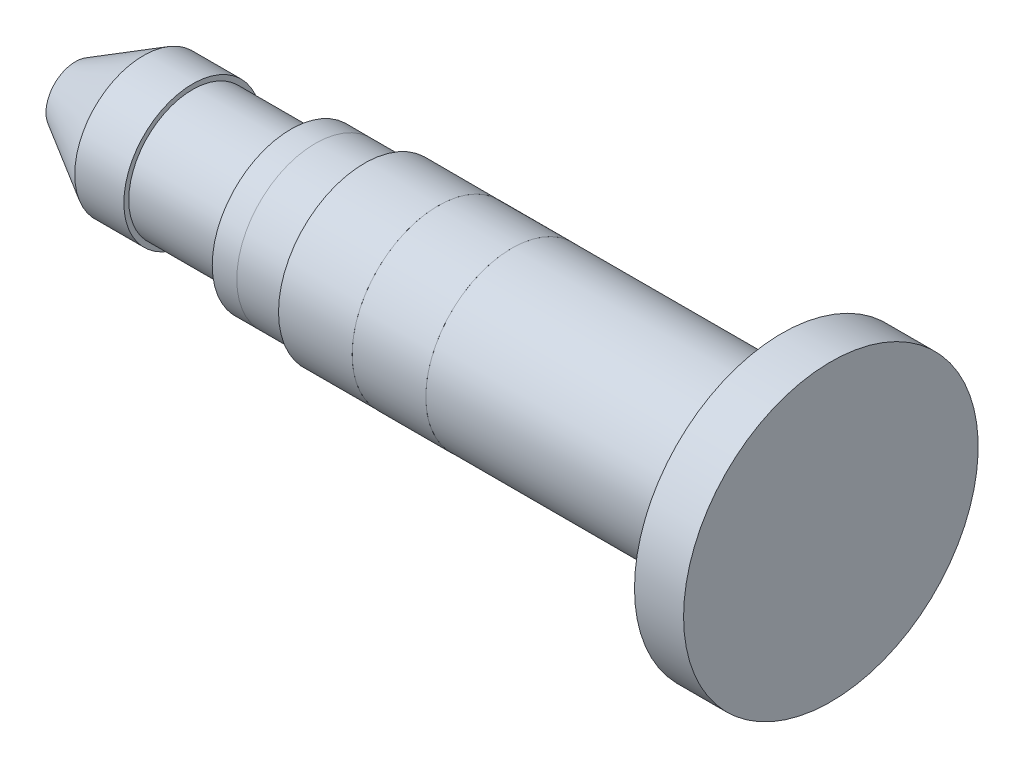
ISO-10303-21;
HEADER;
FILE_DESCRIPTION(('STEP AP214'),'2;1');
FILE_NAME('part.step','',(''),(''),'','','');
FILE_SCHEMA(('AUTOMOTIVE_DESIGN { 1 0 10303 214 1 1 1 1 }'));
ENDSEC;
DATA;
#1=APPLICATION_CONTEXT('core data for automotive mechanical design processes');
#2=APPLICATION_PROTOCOL_DEFINITION('international standard','automotive_design',2000,#1);
#3=PRODUCT_CONTEXT('',#1,'mechanical');
#4=PRODUCT('Part','Part','',(#3));
#5=PRODUCT_RELATED_PRODUCT_CATEGORY('part','',(#4));
#6=PRODUCT_DEFINITION_FORMATION('','',#4);
#7=PRODUCT_DEFINITION_CONTEXT('part definition',#1,'design');
#8=PRODUCT_DEFINITION('design','',#6,#7);
#9=PRODUCT_DEFINITION_SHAPE('','',#8);
#10=(LENGTH_UNIT() NAMED_UNIT(*) SI_UNIT(.MILLI.,.METRE.));
#11=(NAMED_UNIT(*) PLANE_ANGLE_UNIT() SI_UNIT($,.RADIAN.));
#12=(NAMED_UNIT(*) SI_UNIT($,.STERADIAN.) SOLID_ANGLE_UNIT());
#13=UNCERTAINTY_MEASURE_WITH_UNIT(LENGTH_MEASURE(1.E-05),#10,'distance_accuracy_value','');
#14=(GEOMETRIC_REPRESENTATION_CONTEXT(3) GLOBAL_UNCERTAINTY_ASSIGNED_CONTEXT((#13)) GLOBAL_UNIT_ASSIGNED_CONTEXT((#10,
#11,#12)) REPRESENTATION_CONTEXT('',''));
#15=CARTESIAN_POINT('',(0.,0.,0.));
#16=DIRECTION('',(0.,0.,1.));
#17=DIRECTION('',(1.,0.,0.));
#18=AXIS2_PLACEMENT_3D('',#15,#16,#17);
#19=CARTESIAN_POINT('',(-10.5,0.,0.));
#20=DIRECTION('',(1.,0.,0.));
#21=DIRECTION('',(0.,0.,-1.));
#22=AXIS2_PLACEMENT_3D('',#19,#20,#21);
#23=PLANE('',#22);
#24=CARTESIAN_POINT('',(-10.5,0.,0.));
#25=DIRECTION('',(1.,0.,0.));
#26=DIRECTION('',(0.,0.,-1.));
#27=AXIS2_PLACEMENT_3D('',#24,#25,#26);
#28=CIRCLE('',#27,1.6);
#29=CARTESIAN_POINT('',(-10.5,0.,-1.6));
#30=VERTEX_POINT('',#29);
#31=EDGE_CURVE('E51',#30,#30,#28,.T.);
#32=ORIENTED_EDGE('',*,*,#31,.T.);
#33=EDGE_LOOP('',(#32));
#34=FACE_BOUND('',#33,.T.);
#35=ADVANCED_FACE('F47',(#34),#23,.T.);
#36=CARTESIAN_POINT('',(-28.8976333925778,0.,0.));
#37=DIRECTION('',(-1.,0.,0.));
#38=DIRECTION('',(0.,0.,1.));
#39=AXIS2_PLACEMENT_3D('',#36,#37,#38);
#40=CYLINDRICAL_SURFACE('',#39,1.3);
#41=CARTESIAN_POINT('',(-13.,0.,0.));
#42=DIRECTION('',(-1.,0.,0.));
#43=DIRECTION('',(0.,0.,1.));
#44=AXIS2_PLACEMENT_3D('',#41,#42,#43);
#45=CIRCLE('',#44,1.3);
#46=CARTESIAN_POINT('',(-13.,0.,1.3));
#47=VERTEX_POINT('',#46);
#48=EDGE_CURVE('E59',#47,#47,#45,.T.);
#49=ORIENTED_EDGE('',*,*,#48,.F.);
#50=EDGE_LOOP('',(#49));
#51=FACE_BOUND('',#50,.T.);
#52=CARTESIAN_POINT('',(-11.,0.,0.));
#53=DIRECTION('',(-1.,0.,0.));
#54=DIRECTION('',(0.,0.,1.));
#55=AXIS2_PLACEMENT_3D('',#52,#53,#54);
#56=CIRCLE('',#55,1.3);
#57=CARTESIAN_POINT('',(-11.,0.,1.3));
#58=VERTEX_POINT('',#57);
#59=EDGE_CURVE('E64',#58,#58,#56,.T.);
#60=ORIENTED_EDGE('',*,*,#59,.T.);
#61=EDGE_LOOP('',(#60));
#62=FACE_BOUND('',#61,.T.);
#63=ADVANCED_FACE('F87',(#51,#62),#40,.T.);
#64=CARTESIAN_POINT('',(-15.3856406460551,-13.4447649628226,0.));
#65=DIRECTION('',(1.,0.,0.));
#66=DIRECTION('',(0.,0.,-1.));
#67=AXIS2_PLACEMENT_3D('',#64,#65,#66);
#68=PLANE('',#67);
#69=CARTESIAN_POINT('',(-15.3856406460551,0.,0.));
#70=DIRECTION('',(-1.,0.,0.));
#71=DIRECTION('',(0.,0.,1.));
#72=AXIS2_PLACEMENT_3D('',#69,#70,#71);
#73=CIRCLE('',#72,0.600000000000002);
#74=CARTESIAN_POINT('',(-15.3856406460551,0.,0.600000000000002));
#75=VERTEX_POINT('',#74);
#76=EDGE_CURVE('E70',#75,#75,#73,.T.);
#77=ORIENTED_EDGE('',*,*,#76,.T.);
#78=EDGE_LOOP('',(#77));
#79=FACE_BOUND('',#78,.T.);
#80=ADVANCED_FACE('F90',(#79),#68,.F.);
#81=CARTESIAN_POINT('',(-14.,0.,0.));
#82=DIRECTION('',(1.,0.,0.));
#83=DIRECTION('',(0.,0.,-1.));
#84=AXIS2_PLACEMENT_3D('',#81,#82,#83);
#85=CONICAL_SURFACE('',#84,1.4,0.523598775598299);
#86=ORIENTED_EDGE('',*,*,#76,.F.);
#87=EDGE_LOOP('',(#86));
#88=FACE_BOUND('',#87,.T.);
#89=CARTESIAN_POINT('',(-14.,0.,0.));
#90=DIRECTION('',(-1.,0.,0.));
#91=DIRECTION('',(0.,0.,1.));
#92=AXIS2_PLACEMENT_3D('',#89,#90,#91);
#93=CIRCLE('',#92,1.4);
#94=CARTESIAN_POINT('',(-14.,0.,1.4));
#95=VERTEX_POINT('',#94);
#96=EDGE_CURVE('E12',#95,#95,#93,.T.);
#97=ORIENTED_EDGE('',*,*,#96,.T.);
#98=EDGE_LOOP('',(#97));
#99=FACE_BOUND('',#98,.T.);
#100=ADVANCED_FACE('F92',(#88,#99),#85,.T.);
#101=CARTESIAN_POINT('',(-28.8976333925778,0.,0.));
#102=DIRECTION('',(-1.,0.,0.));
#103=DIRECTION('',(0.,0.,1.));
#104=AXIS2_PLACEMENT_3D('',#101,#102,#103);
#105=CYLINDRICAL_SURFACE('',#104,1.4);
#106=ORIENTED_EDGE('',*,*,#96,.F.);
#107=EDGE_LOOP('',(#106));
#108=FACE_BOUND('',#107,.T.);
#109=CARTESIAN_POINT('',(-13.,0.,0.));
#110=DIRECTION('',(-1.,0.,0.));
#111=DIRECTION('',(0.,0.,1.));
#112=AXIS2_PLACEMENT_3D('',#109,#110,#111);
#113=CIRCLE('',#112,1.4);
#114=CARTESIAN_POINT('',(-13.,0.,1.4));
#115=VERTEX_POINT('',#114);
#116=EDGE_CURVE('E55',#115,#115,#113,.T.);
#117=ORIENTED_EDGE('',*,*,#116,.T.);
#118=EDGE_LOOP('',(#117));
#119=FACE_BOUND('',#118,.T.);
#120=ADVANCED_FACE('F98',(#108,#119),#105,.T.);
#121=CARTESIAN_POINT('',(-13.,-13.4447649628227,0.));
#122=DIRECTION('',(-1.,0.,0.));
#123=DIRECTION('',(0.,0.,1.));
#124=AXIS2_PLACEMENT_3D('',#121,#122,#123);
#125=PLANE('',#124);
#126=ORIENTED_EDGE('',*,*,#116,.F.);
#127=EDGE_LOOP('',(#126));
#128=FACE_BOUND('',#127,.T.);
#129=ORIENTED_EDGE('',*,*,#48,.T.);
#130=EDGE_LOOP('',(#129));
#131=FACE_BOUND('',#130,.T.);
#132=ADVANCED_FACE('F84',(#128,#131),#125,.F.);
#133=CARTESIAN_POINT('',(-11.,-13.4447649628226,0.));
#134=DIRECTION('',(1.,0.,0.));
#135=DIRECTION('',(0.,0.,-1.));
#136=AXIS2_PLACEMENT_3D('',#133,#134,#135);
#137=PLANE('',#136);
#138=ORIENTED_EDGE('',*,*,#59,.F.);
#139=EDGE_LOOP('',(#138));
#140=FACE_BOUND('',#139,.T.);
#141=CARTESIAN_POINT('',(-11.,0.,0.));
#142=DIRECTION('',(-1.,0.,0.));
#143=DIRECTION('',(0.,0.,1.));
#144=AXIS2_PLACEMENT_3D('',#141,#142,#143);
#145=CIRCLE('',#144,1.6);
#146=CARTESIAN_POINT('',(-11.,0.,1.6));
#147=VERTEX_POINT('',#146);
#148=EDGE_CURVE('E67',#147,#147,#145,.T.);
#149=ORIENTED_EDGE('',*,*,#148,.T.);
#150=EDGE_LOOP('',(#149));
#151=FACE_BOUND('',#150,.T.);
#152=ADVANCED_FACE('F79',(#140,#151),#137,.F.);
#153=CARTESIAN_POINT('',(-28.8976333925778,0.,0.));
#154=DIRECTION('',(-1.,0.,0.));
#155=DIRECTION('',(0.,0.,1.));
#156=AXIS2_PLACEMENT_3D('',#153,#154,#155);
#157=CYLINDRICAL_SURFACE('',#156,1.6);
#158=ORIENTED_EDGE('',*,*,#148,.F.);
#159=EDGE_LOOP('',(#158));
#160=FACE_BOUND('',#159,.T.);
#161=ORIENTED_EDGE('',*,*,#31,.F.);
#162=EDGE_LOOP('',(#161));
#163=FACE_BOUND('',#162,.T.);
#164=ADVANCED_FACE('F49',(#160,#163),#157,.T.);
#165=CLOSED_SHELL('',(#35,#63,#80,#100,#120,#132,#152,#164));
#166=MANIFOLD_SOLID_BREP('B2',#165);
#167=CARTESIAN_POINT('',(-6.5,0.,0.));
#168=DIRECTION('',(1.,0.,0.));
#169=DIRECTION('',(0.,0.,-1.));
#170=AXIS2_PLACEMENT_3D('',#167,#168,#169);
#171=PLANE('',#170);
#172=CARTESIAN_POINT('',(-6.5,0.,0.));
#173=DIRECTION('',(1.,0.,0.));
#174=DIRECTION('',(0.,0.,-1.));
#175=AXIS2_PLACEMENT_3D('',#172,#173,#174);
#176=CIRCLE('',#175,1.75);
#177=CARTESIAN_POINT('',(-6.5,0.,-1.75));
#178=VERTEX_POINT('',#177);
#179=EDGE_CURVE('E189',#178,#178,#176,.T.);
#180=ORIENTED_EDGE('',*,*,#179,.F.);
#181=EDGE_LOOP('',(#180));
#182=FACE_BOUND('',#181,.T.);
#183=ADVANCED_FACE('F185',(#182),#171,.F.);
#184=CARTESIAN_POINT('',(-28.8976333925778,0.,0.));
#185=DIRECTION('',(-1.,0.,0.));
#186=DIRECTION('',(0.,0.,1.));
#187=AXIS2_PLACEMENT_3D('',#184,#185,#186);
#188=CYLINDRICAL_SURFACE('',#187,1.75);
#189=ORIENTED_EDGE('',*,*,#179,.T.);
#190=EDGE_LOOP('',(#189));
#191=FACE_BOUND('',#190,.T.);
#192=CARTESIAN_POINT('',(-1.,0.,0.));
#193=DIRECTION('',(-1.,0.,0.));
#194=DIRECTION('',(0.,0.,1.));
#195=AXIS2_PLACEMENT_3D('',#192,#193,#194);
#196=CIRCLE('',#195,1.75);
#197=CARTESIAN_POINT('',(-1.,0.,1.75));
#198=VERTEX_POINT('',#197);
#199=EDGE_CURVE('E46',#198,#198,#196,.T.);
#200=ORIENTED_EDGE('',*,*,#199,.T.);
#201=EDGE_LOOP('',(#200));
#202=FACE_BOUND('',#201,.T.);
#203=ADVANCED_FACE('F187',(#191,#202),#188,.T.);
#204=CARTESIAN_POINT('',(0.,-13.4447649628226,0.));
#205=DIRECTION('',(-1.,0.,0.));
#206=DIRECTION('',(0.,0.,1.));
#207=AXIS2_PLACEMENT_3D('',#204,#205,#206);
#208=PLANE('',#207);
#209=CARTESIAN_POINT('',(0.,0.,0.));
#210=DIRECTION('',(-1.,0.,0.));
#211=DIRECTION('',(0.,0.,1.));
#212=AXIS2_PLACEMENT_3D('',#209,#210,#211);
#213=CIRCLE('',#212,3.);
#214=CARTESIAN_POINT('',(0.,0.,3.));
#215=VERTEX_POINT('',#214);
#216=EDGE_CURVE('E197',#215,#215,#213,.T.);
#217=ORIENTED_EDGE('',*,*,#216,.F.);
#218=EDGE_LOOP('',(#217));
#219=FACE_BOUND('',#218,.T.);
#220=ADVANCED_FACE('F212',(#219),#208,.F.);
#221=CARTESIAN_POINT('',(-28.8976333925778,0.,0.));
#222=DIRECTION('',(-1.,0.,0.));
#223=DIRECTION('',(0.,0.,1.));
#224=AXIS2_PLACEMENT_3D('',#221,#222,#223);
#225=CYLINDRICAL_SURFACE('',#224,3.);
#226=CARTESIAN_POINT('',(-1.,0.,0.));
#227=DIRECTION('',(-1.,0.,0.));
#228=DIRECTION('',(0.,0.,1.));
#229=AXIS2_PLACEMENT_3D('',#226,#227,#228);
#230=CIRCLE('',#229,3.);
#231=CARTESIAN_POINT('',(-1.,0.,3.));
#232=VERTEX_POINT('',#231);
#233=EDGE_CURVE('E193',#232,#232,#230,.T.);
#234=ORIENTED_EDGE('',*,*,#233,.F.);
#235=EDGE_LOOP('',(#234));
#236=FACE_BOUND('',#235,.T.);
#237=ORIENTED_EDGE('',*,*,#216,.T.);
#238=EDGE_LOOP('',(#237));
#239=FACE_BOUND('',#238,.T.);
#240=ADVANCED_FACE('F215',(#236,#239),#225,.T.);
#241=CARTESIAN_POINT('',(-1.,-13.4447649628226,0.));
#242=DIRECTION('',(1.,0.,0.));
#243=DIRECTION('',(0.,0.,-1.));
#244=AXIS2_PLACEMENT_3D('',#241,#242,#243);
#245=PLANE('',#244);
#246=ORIENTED_EDGE('',*,*,#199,.F.);
#247=EDGE_LOOP('',(#246));
#248=FACE_BOUND('',#247,.T.);
#249=ORIENTED_EDGE('',*,*,#233,.T.);
#250=EDGE_LOOP('',(#249));
#251=FACE_BOUND('',#250,.T.);
#252=ADVANCED_FACE('F208',(#248,#251),#245,.F.);
#253=CLOSED_SHELL('',(#183,#203,#220,#240,#252));
#254=MANIFOLD_SOLID_BREP('B7',#253);
#255=CARTESIAN_POINT('',(-8.,0.,0.));
#256=DIRECTION('',(1.,0.,0.));
#257=DIRECTION('',(0.,0.,-1.));
#258=AXIS2_PLACEMENT_3D('',#255,#256,#257);
#259=PLANE('',#258);
#260=CARTESIAN_POINT('',(-8.,0.,0.));
#261=DIRECTION('',(1.,0.,0.));
#262=DIRECTION('',(0.,0.,-1.));
#263=AXIS2_PLACEMENT_3D('',#260,#261,#262);
#264=CIRCLE('',#263,1.75);
#265=CARTESIAN_POINT('',(-8.,0.,-1.75));
#266=VERTEX_POINT('',#265);
#267=EDGE_CURVE('E184',#266,#266,#264,.T.);
#268=ORIENTED_EDGE('',*,*,#267,.F.);
#269=EDGE_LOOP('',(#268));
#270=FACE_BOUND('',#269,.T.);
#271=ADVANCED_FACE('F269',(#270),#259,.F.);
#272=CARTESIAN_POINT('',(-6.5,0.,0.));
#273=DIRECTION('',(1.,0.,0.));
#274=DIRECTION('',(0.,0.,-1.));
#275=AXIS2_PLACEMENT_3D('',#272,#273,#274);
#276=PLANE('',#275);
#277=CARTESIAN_POINT('',(-6.5,0.,0.));
#278=DIRECTION('',(1.,0.,0.));
#279=DIRECTION('',(0.,0.,-1.));
#280=AXIS2_PLACEMENT_3D('',#277,#278,#279);
#281=CIRCLE('',#280,1.75);
#282=CARTESIAN_POINT('',(-6.5,0.,-1.75));
#283=VERTEX_POINT('',#282);
#284=EDGE_CURVE('E273',#283,#283,#281,.T.);
#285=ORIENTED_EDGE('',*,*,#284,.T.);
#286=EDGE_LOOP('',(#285));
#287=FACE_BOUND('',#286,.T.);
#288=ADVANCED_FACE('F282',(#287),#276,.T.);
#289=CARTESIAN_POINT('',(-28.8976333925778,0.,0.));
#290=DIRECTION('',(-1.,0.,0.));
#291=DIRECTION('',(0.,0.,1.));
#292=AXIS2_PLACEMENT_3D('',#289,#290,#291);
#293=CYLINDRICAL_SURFACE('',#292,1.75);
#294=ORIENTED_EDGE('',*,*,#267,.T.);
#295=EDGE_LOOP('',(#294));
#296=FACE_BOUND('',#295,.T.);
#297=ORIENTED_EDGE('',*,*,#284,.F.);
#298=EDGE_LOOP('',(#297));
#299=FACE_BOUND('',#298,.T.);
#300=ADVANCED_FACE('F271',(#296,#299),#293,.T.);
#301=CLOSED_SHELL('',(#271,#288,#300));
#302=MANIFOLD_SOLID_BREP('B41',#301);
#303=CARTESIAN_POINT('',(-10.5,0.,0.));
#304=DIRECTION('',(1.,0.,0.));
#305=DIRECTION('',(0.,0.,-1.));
#306=AXIS2_PLACEMENT_3D('',#303,#304,#305);
#307=PLANE('',#306);
#308=CARTESIAN_POINT('',(-10.5,0.,0.));
#309=DIRECTION('',(1.,0.,0.));
#310=DIRECTION('',(0.,0.,-1.));
#311=AXIS2_PLACEMENT_3D('',#308,#309,#310);
#312=CIRCLE('',#311,1.6);
#313=CARTESIAN_POINT('',(-10.5,0.,-1.6));
#314=VERTEX_POINT('',#313);
#315=EDGE_CURVE('E318',#314,#314,#312,.T.);
#316=ORIENTED_EDGE('',*,*,#315,.F.);
#317=EDGE_LOOP('',(#316));
#318=FACE_BOUND('',#317,.T.);
#319=ADVANCED_FACE('F312',(#318),#307,.F.);
#320=CARTESIAN_POINT('',(-8.,0.,0.));
#321=DIRECTION('',(1.,0.,0.));
#322=DIRECTION('',(0.,0.,-1.));
#323=AXIS2_PLACEMENT_3D('',#320,#321,#322);
#324=PLANE('',#323);
#325=CARTESIAN_POINT('',(-8.,0.,0.));
#326=DIRECTION('',(1.,0.,0.));
#327=DIRECTION('',(0.,0.,-1.));
#328=AXIS2_PLACEMENT_3D('',#325,#326,#327);
#329=CIRCLE('',#328,1.75);
#330=CARTESIAN_POINT('',(-8.,0.,-1.75));
#331=VERTEX_POINT('',#330);
#332=EDGE_CURVE('E268',#331,#331,#329,.T.);
#333=ORIENTED_EDGE('',*,*,#332,.T.);
#334=EDGE_LOOP('',(#333));
#335=FACE_BOUND('',#334,.T.);
#336=ADVANCED_FACE('F344',(#335),#324,.T.);
#337=CARTESIAN_POINT('',(-28.8976333925778,0.,0.));
#338=DIRECTION('',(-1.,0.,0.));
#339=DIRECTION('',(0.,0.,1.));
#340=AXIS2_PLACEMENT_3D('',#337,#338,#339);
#341=CYLINDRICAL_SURFACE('',#340,1.6);
#342=ORIENTED_EDGE('',*,*,#315,.T.);
#343=EDGE_LOOP('',(#342));
#344=FACE_BOUND('',#343,.T.);
#345=CARTESIAN_POINT('',(-9.5,0.,0.));
#346=DIRECTION('',(-1.,0.,0.));
#347=DIRECTION('',(0.,0.,1.));
#348=AXIS2_PLACEMENT_3D('',#345,#346,#347);
#349=CIRCLE('',#348,1.6);
#350=CARTESIAN_POINT('',(-9.5,0.,1.6));
#351=VERTEX_POINT('',#350);
#352=EDGE_CURVE('E326',#351,#351,#349,.T.);
#353=ORIENTED_EDGE('',*,*,#352,.T.);
#354=EDGE_LOOP('',(#353));
#355=FACE_BOUND('',#354,.T.);
#356=ADVANCED_FACE('F332',(#344,#355),#341,.T.);
#357=CARTESIAN_POINT('',(-9.5,-13.4447649628226,0.));
#358=DIRECTION('',(1.,0.,0.));
#359=DIRECTION('',(0.,0.,-1.));
#360=AXIS2_PLACEMENT_3D('',#357,#358,#359);
#361=PLANE('',#360);
#362=ORIENTED_EDGE('',*,*,#352,.F.);
#363=EDGE_LOOP('',(#362));
#364=FACE_BOUND('',#363,.T.);
#365=CARTESIAN_POINT('',(-9.5,0.,0.));
#366=DIRECTION('',(-1.,0.,0.));
#367=DIRECTION('',(0.,0.,1.));
#368=AXIS2_PLACEMENT_3D('',#365,#366,#367);
#369=CIRCLE('',#368,1.75);
#370=CARTESIAN_POINT('',(-9.5,0.,1.75));
#371=VERTEX_POINT('',#370);
#372=EDGE_CURVE('E322',#371,#371,#369,.T.);
#373=ORIENTED_EDGE('',*,*,#372,.T.);
#374=EDGE_LOOP('',(#373));
#375=FACE_BOUND('',#374,.T.);
#376=ADVANCED_FACE('F334',(#364,#375),#361,.F.);
#377=CARTESIAN_POINT('',(-28.8976333925778,0.,0.));
#378=DIRECTION('',(-1.,0.,0.));
#379=DIRECTION('',(0.,0.,1.));
#380=AXIS2_PLACEMENT_3D('',#377,#378,#379);
#381=CYLINDRICAL_SURFACE('',#380,1.75);
#382=ORIENTED_EDGE('',*,*,#372,.F.);
#383=EDGE_LOOP('',(#382));
#384=FACE_BOUND('',#383,.T.);
#385=ORIENTED_EDGE('',*,*,#332,.F.);
#386=EDGE_LOOP('',(#385));
#387=FACE_BOUND('',#386,.T.);
#388=ADVANCED_FACE('F337',(#384,#387),#381,.T.);
#389=CLOSED_SHELL('',(#319,#336,#356,#376,#388));
#390=MANIFOLD_SOLID_BREP('B179',#389);
#391=ADVANCED_BREP_SHAPE_REPRESENTATION('',(#18,#166,#254,#302,#390),#14);
#392=SHAPE_DEFINITION_REPRESENTATION(#9,#391);
ENDSEC;
END-ISO-10303-21;
